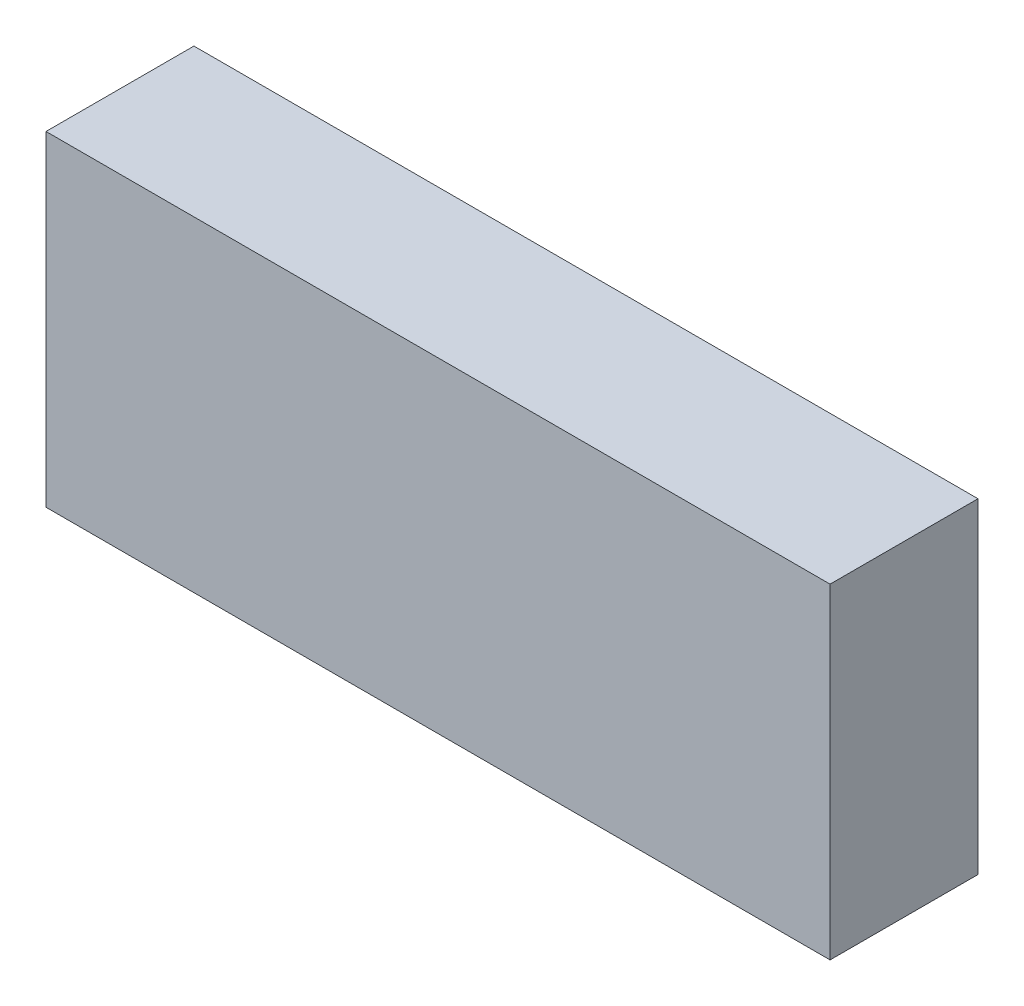
ISO-10303-21;
HEADER;
FILE_DESCRIPTION(('STEP AP214'),'2;1');
FILE_NAME('part.step','',(''),(''),'','','');
FILE_SCHEMA(('AUTOMOTIVE_DESIGN { 1 0 10303 214 1 1 1 1 }'));
ENDSEC;
DATA;
#1=APPLICATION_CONTEXT('core data for automotive mechanical design processes');
#2=APPLICATION_PROTOCOL_DEFINITION('international standard','automotive_design',2000,#1);
#3=PRODUCT_CONTEXT('',#1,'mechanical');
#4=PRODUCT('Part','Part','',(#3));
#5=PRODUCT_RELATED_PRODUCT_CATEGORY('part','',(#4));
#6=PRODUCT_DEFINITION_FORMATION('','',#4);
#7=PRODUCT_DEFINITION_CONTEXT('part definition',#1,'design');
#8=PRODUCT_DEFINITION('design','',#6,#7);
#9=PRODUCT_DEFINITION_SHAPE('','',#8);
#10=(LENGTH_UNIT() NAMED_UNIT(*) SI_UNIT(.MILLI.,.METRE.));
#11=(NAMED_UNIT(*) PLANE_ANGLE_UNIT() SI_UNIT($,.RADIAN.));
#12=(NAMED_UNIT(*) SI_UNIT($,.STERADIAN.) SOLID_ANGLE_UNIT());
#13=UNCERTAINTY_MEASURE_WITH_UNIT(LENGTH_MEASURE(1.E-05),#10,'distance_accuracy_value','');
#14=(GEOMETRIC_REPRESENTATION_CONTEXT(3) GLOBAL_UNCERTAINTY_ASSIGNED_CONTEXT((#13)) GLOBAL_UNIT_ASSIGNED_CONTEXT((#10,
#11,#12)) REPRESENTATION_CONTEXT('',''));
#15=CARTESIAN_POINT('',(0.,0.,0.));
#16=DIRECTION('',(0.,0.,1.));
#17=DIRECTION('',(1.,0.,0.));
#18=AXIS2_PLACEMENT_3D('',#15,#16,#17);
#19=CARTESIAN_POINT('',(0.,0.,5.));
#20=DIRECTION('',(0.,0.,1.));
#21=DIRECTION('',(1.,0.,0.));
#22=AXIS2_PLACEMENT_3D('',#19,#20,#21);
#23=PLANE('',#22);
#24=DIRECTION('',(-1.,0.,0.));
#25=VECTOR('',#24,1.);
#26=CARTESIAN_POINT('',(0.,-11.,5.));
#27=LINE('',#26,#25);
#28=CARTESIAN_POINT('',(26.5,-11.,5.));
#29=VERTEX_POINT('',#28);
#30=CARTESIAN_POINT('',(-26.5,-11.,5.));
#31=VERTEX_POINT('',#30);
#32=EDGE_CURVE('E10',#29,#31,#27,.T.);
#33=ORIENTED_EDGE('',*,*,#32,.F.);
#34=DIRECTION('',(0.,-1.,0.));
#35=VECTOR('',#34,1.);
#36=CARTESIAN_POINT('',(26.5,0.,5.));
#37=LINE('',#36,#35);
#38=CARTESIAN_POINT('',(26.5,11.,5.));
#39=VERTEX_POINT('',#38);
#40=EDGE_CURVE('E58',#39,#29,#37,.T.);
#41=ORIENTED_EDGE('',*,*,#40,.F.);
#42=DIRECTION('',(1.,0.,0.));
#43=VECTOR('',#42,1.);
#44=CARTESIAN_POINT('',(0.,11.,5.));
#45=LINE('',#44,#43);
#46=CARTESIAN_POINT('',(-26.5,11.,5.));
#47=VERTEX_POINT('',#46);
#48=EDGE_CURVE('E88',#47,#39,#45,.T.);
#49=ORIENTED_EDGE('',*,*,#48,.F.);
#50=DIRECTION('',(0.,1.,0.));
#51=VECTOR('',#50,1.);
#52=CARTESIAN_POINT('',(-26.5,0.,5.));
#53=LINE('',#52,#51);
#54=EDGE_CURVE('E23',#31,#47,#53,.T.);
#55=ORIENTED_EDGE('',*,*,#54,.F.);
#56=EDGE_LOOP('',(#33,#41,#49,#55));
#57=FACE_BOUND('',#56,.T.);
#58=ADVANCED_FACE('F16',(#57),#23,.T.);
#59=CARTESIAN_POINT('',(0.,-11.,-5.));
#60=DIRECTION('',(0.,-1.,0.));
#61=DIRECTION('',(0.,0.,-1.));
#62=AXIS2_PLACEMENT_3D('',#59,#60,#61);
#63=PLANE('',#62);
#64=DIRECTION('',(0.,0.,1.));
#65=VECTOR('',#64,1.);
#66=CARTESIAN_POINT('',(26.5,-11.,-5.));
#67=LINE('',#66,#65);
#68=CARTESIAN_POINT('',(26.5,-11.,-5.));
#69=VERTEX_POINT('',#68);
#70=EDGE_CURVE('E52',#69,#29,#67,.T.);
#71=ORIENTED_EDGE('',*,*,#70,.T.);
#72=ORIENTED_EDGE('',*,*,#32,.T.);
#73=DIRECTION('',(0.,0.,1.));
#74=VECTOR('',#73,1.);
#75=CARTESIAN_POINT('',(-26.5,-11.,-5.));
#76=LINE('',#75,#74);
#77=CARTESIAN_POINT('',(-26.5,-11.,-5.));
#78=VERTEX_POINT('',#77);
#79=EDGE_CURVE('E66',#78,#31,#76,.T.);
#80=ORIENTED_EDGE('',*,*,#79,.F.);
#81=DIRECTION('',(1.,0.,0.));
#82=VECTOR('',#81,1.);
#83=CARTESIAN_POINT('',(0.,-11.,-5.));
#84=LINE('',#83,#82);
#85=EDGE_CURVE('E63',#78,#69,#84,.T.);
#86=ORIENTED_EDGE('',*,*,#85,.T.);
#87=EDGE_LOOP('',(#71,#72,#80,#86));
#88=FACE_BOUND('',#87,.T.);
#89=ADVANCED_FACE('F65',(#88),#63,.T.);
#90=CARTESIAN_POINT('',(-26.5,0.,-5.));
#91=DIRECTION('',(-1.,0.,0.));
#92=DIRECTION('',(0.,0.,1.));
#93=AXIS2_PLACEMENT_3D('',#90,#91,#92);
#94=PLANE('',#93);
#95=ORIENTED_EDGE('',*,*,#79,.T.);
#96=ORIENTED_EDGE('',*,*,#54,.T.);
#97=DIRECTION('',(0.,0.,1.));
#98=VECTOR('',#97,1.);
#99=CARTESIAN_POINT('',(-26.5,11.,-5.));
#100=LINE('',#99,#98);
#101=CARTESIAN_POINT('',(-26.5,11.,-5.));
#102=VERTEX_POINT('',#101);
#103=EDGE_CURVE('E81',#102,#47,#100,.T.);
#104=ORIENTED_EDGE('',*,*,#103,.F.);
#105=DIRECTION('',(0.,-1.,0.));
#106=VECTOR('',#105,1.);
#107=CARTESIAN_POINT('',(-26.5,0.,-5.));
#108=LINE('',#107,#106);
#109=EDGE_CURVE('E69',#102,#78,#108,.T.);
#110=ORIENTED_EDGE('',*,*,#109,.T.);
#111=EDGE_LOOP('',(#95,#96,#104,#110));
#112=FACE_BOUND('',#111,.T.);
#113=ADVANCED_FACE('F89',(#112),#94,.T.);
#114=CARTESIAN_POINT('',(0.,11.,-5.));
#115=DIRECTION('',(0.,1.,0.));
#116=DIRECTION('',(0.,0.,1.));
#117=AXIS2_PLACEMENT_3D('',#114,#115,#116);
#118=PLANE('',#117);
#119=ORIENTED_EDGE('',*,*,#103,.T.);
#120=ORIENTED_EDGE('',*,*,#48,.T.);
#121=DIRECTION('',(0.,0.,1.));
#122=VECTOR('',#121,1.);
#123=CARTESIAN_POINT('',(26.5,11.,-5.));
#124=LINE('',#123,#122);
#125=CARTESIAN_POINT('',(26.5,11.,-5.));
#126=VERTEX_POINT('',#125);
#127=EDGE_CURVE('E61',#126,#39,#124,.T.);
#128=ORIENTED_EDGE('',*,*,#127,.F.);
#129=DIRECTION('',(-1.,0.,0.));
#130=VECTOR('',#129,1.);
#131=CARTESIAN_POINT('',(0.,11.,-5.));
#132=LINE('',#131,#130);
#133=EDGE_CURVE('E74',#126,#102,#132,.T.);
#134=ORIENTED_EDGE('',*,*,#133,.T.);
#135=EDGE_LOOP('',(#119,#120,#128,#134));
#136=FACE_BOUND('',#135,.T.);
#137=ADVANCED_FACE('F86',(#136),#118,.T.);
#138=CARTESIAN_POINT('',(0.,0.,-5.));
#139=DIRECTION('',(0.,0.,-1.));
#140=DIRECTION('',(-1.,0.,0.));
#141=AXIS2_PLACEMENT_3D('',#138,#139,#140);
#142=PLANE('',#141);
#143=DIRECTION('',(0.,1.,0.));
#144=VECTOR('',#143,1.);
#145=CARTESIAN_POINT('',(26.5,0.,-5.));
#146=LINE('',#145,#144);
#147=EDGE_CURVE('E59',#69,#126,#146,.T.);
#148=ORIENTED_EDGE('',*,*,#147,.F.);
#149=ORIENTED_EDGE('',*,*,#85,.F.);
#150=ORIENTED_EDGE('',*,*,#109,.F.);
#151=ORIENTED_EDGE('',*,*,#133,.F.);
#152=EDGE_LOOP('',(#148,#149,#150,#151));
#153=FACE_BOUND('',#152,.T.);
#154=ADVANCED_FACE('F73',(#153),#142,.T.);
#155=CARTESIAN_POINT('',(26.5,0.,-5.));
#156=DIRECTION('',(1.,0.,0.));
#157=DIRECTION('',(0.,0.,-1.));
#158=AXIS2_PLACEMENT_3D('',#155,#156,#157);
#159=PLANE('',#158);
#160=ORIENTED_EDGE('',*,*,#147,.T.);
#161=ORIENTED_EDGE('',*,*,#127,.T.);
#162=ORIENTED_EDGE('',*,*,#40,.T.);
#163=ORIENTED_EDGE('',*,*,#70,.F.);
#164=EDGE_LOOP('',(#160,#161,#162,#163));
#165=FACE_BOUND('',#164,.T.);
#166=ADVANCED_FACE('F54',(#165),#159,.T.);
#167=CLOSED_SHELL('',(#58,#89,#113,#137,#154,#166));
#168=MANIFOLD_SOLID_BREP('B1',#167);
#169=ADVANCED_BREP_SHAPE_REPRESENTATION('',(#18,#168),#14);
#170=SHAPE_DEFINITION_REPRESENTATION(#9,#169);
ENDSEC;
END-ISO-10303-21;
